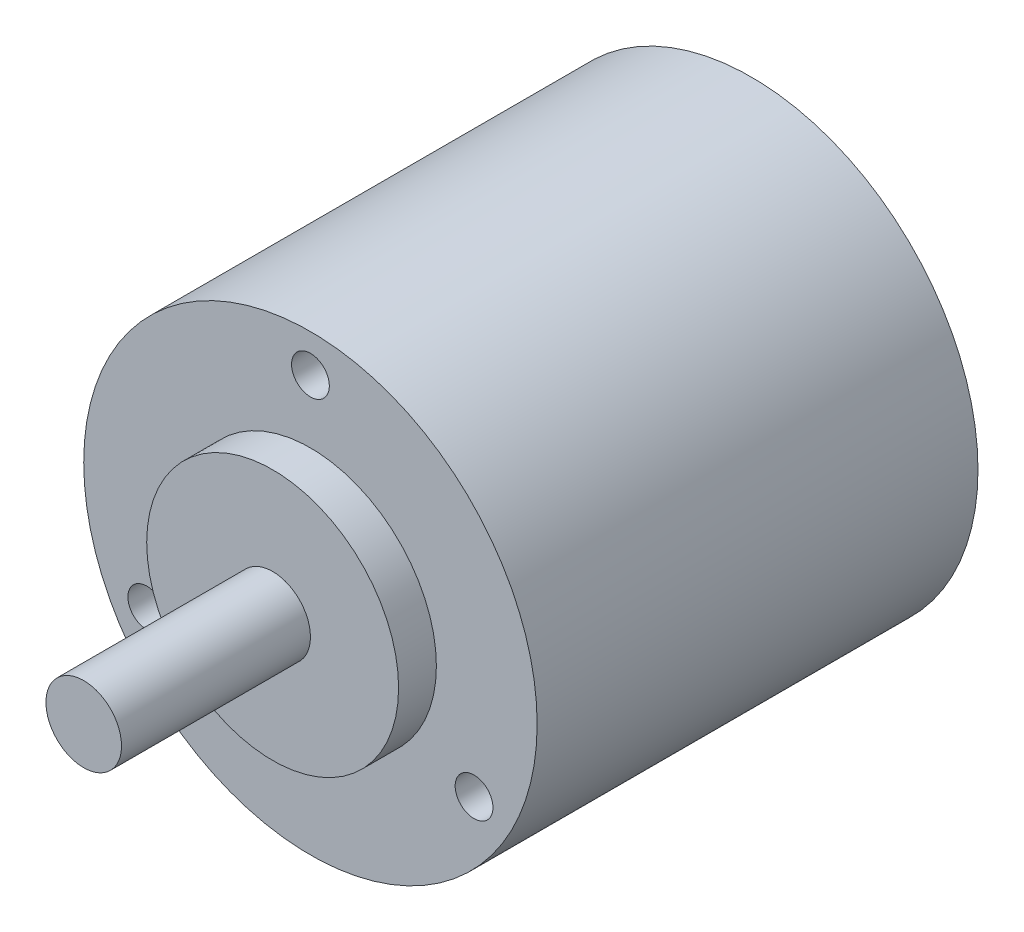
ISO-10303-21;
HEADER;
FILE_DESCRIPTION(('STEP AP214'),'2;1');
FILE_NAME('part.step','',(''),(''),'','','');
FILE_SCHEMA(('AUTOMOTIVE_DESIGN { 1 0 10303 214 1 1 1 1 }'));
ENDSEC;
DATA;
#1=APPLICATION_CONTEXT('core data for automotive mechanical design processes');
#2=APPLICATION_PROTOCOL_DEFINITION('international standard','automotive_design',2000,#1);
#3=PRODUCT_CONTEXT('',#1,'mechanical');
#4=PRODUCT('Part','Part','',(#3));
#5=PRODUCT_RELATED_PRODUCT_CATEGORY('part','',(#4));
#6=PRODUCT_DEFINITION_FORMATION('','',#4);
#7=PRODUCT_DEFINITION_CONTEXT('part definition',#1,'design');
#8=PRODUCT_DEFINITION('design','',#6,#7);
#9=PRODUCT_DEFINITION_SHAPE('','',#8);
#10=(LENGTH_UNIT() NAMED_UNIT(*) SI_UNIT(.MILLI.,.METRE.));
#11=(NAMED_UNIT(*) PLANE_ANGLE_UNIT() SI_UNIT($,.RADIAN.));
#12=(NAMED_UNIT(*) SI_UNIT($,.STERADIAN.) SOLID_ANGLE_UNIT());
#13=UNCERTAINTY_MEASURE_WITH_UNIT(LENGTH_MEASURE(1.E-05),#10,'distance_accuracy_value','');
#14=(GEOMETRIC_REPRESENTATION_CONTEXT(3) GLOBAL_UNCERTAINTY_ASSIGNED_CONTEXT((#13)) GLOBAL_UNIT_ASSIGNED_CONTEXT((#10,
#11,#12)) REPRESENTATION_CONTEXT('',''));
#15=CARTESIAN_POINT('',(0.,0.,0.));
#16=DIRECTION('',(0.,0.,1.));
#17=DIRECTION('',(1.,0.,0.));
#18=AXIS2_PLACEMENT_3D('',#15,#16,#17);
#19=CARTESIAN_POINT('',(0.,0.,35.));
#20=DIRECTION('',(0.,0.,-1.));
#21=DIRECTION('',(-1.,0.,0.));
#22=AXIS2_PLACEMENT_3D('',#19,#20,#21);
#23=CYLINDRICAL_SURFACE('',#22,18.);
#24=CARTESIAN_POINT('',(0.,0.,35.));
#25=DIRECTION('',(0.,0.,1.));
#26=DIRECTION('',(1.,0.,0.));
#27=AXIS2_PLACEMENT_3D('',#24,#25,#26);
#28=CIRCLE('',#27,18.);
#29=CARTESIAN_POINT('',(18.,0.,35.));
#30=VERTEX_POINT('',#29);
#31=EDGE_CURVE('E10',#30,#30,#28,.T.);
#32=ORIENTED_EDGE('',*,*,#31,.F.);
#33=EDGE_LOOP('',(#32));
#34=FACE_BOUND('',#33,.T.);
#35=CARTESIAN_POINT('',(0.,0.,0.));
#36=DIRECTION('',(0.,0.,1.));
#37=DIRECTION('',(1.,0.,0.));
#38=AXIS2_PLACEMENT_3D('',#35,#36,#37);
#39=CIRCLE('',#38,18.);
#40=CARTESIAN_POINT('',(18.,0.,0.));
#41=VERTEX_POINT('',#40);
#42=EDGE_CURVE('E33',#41,#41,#39,.T.);
#43=ORIENTED_EDGE('',*,*,#42,.T.);
#44=EDGE_LOOP('',(#43));
#45=FACE_BOUND('',#44,.T.);
#46=ADVANCED_FACE('F30',(#34,#45),#23,.T.);
#47=CARTESIAN_POINT('',(0.,0.,35.));
#48=DIRECTION('',(0.,0.,1.));
#49=DIRECTION('',(1.,0.,0.));
#50=AXIS2_PLACEMENT_3D('',#47,#48,#49);
#51=PLANE('',#50);
#52=CARTESIAN_POINT('',(12.9903810567675,-7.49999999999944,35.));
#53=DIRECTION('',(0.,0.,1.));
#54=DIRECTION('',(1.,0.,0.));
#55=AXIS2_PLACEMENT_3D('',#52,#53,#54);
#56=CIRCLE('',#55,1.50000000000082);
#57=CARTESIAN_POINT('',(14.4903810567684,-7.49999999999944,35.));
#58=VERTEX_POINT('',#57);
#59=EDGE_CURVE('E66',#58,#58,#56,.T.);
#60=ORIENTED_EDGE('',*,*,#59,.F.);
#61=EDGE_LOOP('',(#60));
#62=FACE_BOUND('',#61,.T.);
#63=CARTESIAN_POINT('',(-12.9903810567656,-7.50000000000056,35.));
#64=DIRECTION('',(0.,0.,1.));
#65=DIRECTION('',(1.,0.,0.));
#66=AXIS2_PLACEMENT_3D('',#63,#64,#65);
#67=CIRCLE('',#66,1.50000000000122);
#68=CARTESIAN_POINT('',(-11.4903810567644,-7.50000000000056,35.));
#69=VERTEX_POINT('',#68);
#70=EDGE_CURVE('E60',#69,#69,#67,.T.);
#71=ORIENTED_EDGE('',*,*,#70,.F.);
#72=EDGE_LOOP('',(#71));
#73=FACE_BOUND('',#72,.T.);
#74=CARTESIAN_POINT('',(0.,15.,35.));
#75=DIRECTION('',(0.,0.,1.));
#76=DIRECTION('',(1.,0.,0.));
#77=AXIS2_PLACEMENT_3D('',#74,#75,#76);
#78=CIRCLE('',#77,1.5);
#79=CARTESIAN_POINT('',(1.5,15.,35.));
#80=VERTEX_POINT('',#79);
#81=EDGE_CURVE('E54',#80,#80,#78,.T.);
#82=ORIENTED_EDGE('',*,*,#81,.F.);
#83=EDGE_LOOP('',(#82));
#84=FACE_BOUND('',#83,.T.);
#85=CARTESIAN_POINT('',(0.,0.,35.));
#86=DIRECTION('',(0.,0.,1.));
#87=DIRECTION('',(1.,0.,0.));
#88=AXIS2_PLACEMENT_3D('',#85,#86,#87);
#89=CIRCLE('',#88,10.);
#90=CARTESIAN_POINT('',(10.,0.,35.));
#91=VERTEX_POINT('',#90);
#92=EDGE_CURVE('E42',#91,#91,#89,.T.);
#93=ORIENTED_EDGE('',*,*,#92,.F.);
#94=EDGE_LOOP('',(#93));
#95=FACE_BOUND('',#94,.T.);
#96=ORIENTED_EDGE('',*,*,#31,.T.);
#97=EDGE_LOOP('',(#96));
#98=FACE_BOUND('',#97,.T.);
#99=ADVANCED_FACE('F81',(#62,#73,#84,#95,#98),#51,.T.);
#100=CARTESIAN_POINT('',(0.,0.,0.));
#101=DIRECTION('',(0.,0.,1.));
#102=DIRECTION('',(1.,0.,0.));
#103=AXIS2_PLACEMENT_3D('',#100,#101,#102);
#104=PLANE('',#103);
#105=ORIENTED_EDGE('',*,*,#42,.F.);
#106=EDGE_LOOP('',(#105));
#107=FACE_BOUND('',#106,.T.);
#108=ADVANCED_FACE('F84',(#107),#104,.F.);
#109=CARTESIAN_POINT('',(0.,0.,38.));
#110=DIRECTION('',(0.,0.,-1.));
#111=DIRECTION('',(-1.,0.,0.));
#112=AXIS2_PLACEMENT_3D('',#109,#110,#111);
#113=CYLINDRICAL_SURFACE('',#112,10.);
#114=CARTESIAN_POINT('',(0.,0.,38.));
#115=DIRECTION('',(0.,0.,1.));
#116=DIRECTION('',(1.,0.,0.));
#117=AXIS2_PLACEMENT_3D('',#114,#115,#116);
#118=CIRCLE('',#117,10.);
#119=CARTESIAN_POINT('',(10.,0.,38.));
#120=VERTEX_POINT('',#119);
#121=EDGE_CURVE('E40',#120,#120,#118,.T.);
#122=ORIENTED_EDGE('',*,*,#121,.F.);
#123=EDGE_LOOP('',(#122));
#124=FACE_BOUND('',#123,.T.);
#125=ORIENTED_EDGE('',*,*,#92,.T.);
#126=EDGE_LOOP('',(#125));
#127=FACE_BOUND('',#126,.T.);
#128=ADVANCED_FACE('F92',(#124,#127),#113,.T.);
#129=CARTESIAN_POINT('',(0.,0.,38.));
#130=DIRECTION('',(0.,0.,1.));
#131=DIRECTION('',(1.,0.,0.));
#132=AXIS2_PLACEMENT_3D('',#129,#130,#131);
#133=PLANE('',#132);
#134=CARTESIAN_POINT('',(0.,0.,38.));
#135=DIRECTION('',(0.,0.,1.));
#136=DIRECTION('',(1.,0.,0.));
#137=AXIS2_PLACEMENT_3D('',#134,#135,#136);
#138=CIRCLE('',#137,3.);
#139=CARTESIAN_POINT('',(3.,0.,38.));
#140=VERTEX_POINT('',#139);
#141=EDGE_CURVE('E48',#140,#140,#138,.T.);
#142=ORIENTED_EDGE('',*,*,#141,.F.);
#143=EDGE_LOOP('',(#142));
#144=FACE_BOUND('',#143,.T.);
#145=ORIENTED_EDGE('',*,*,#121,.T.);
#146=EDGE_LOOP('',(#145));
#147=FACE_BOUND('',#146,.T.);
#148=ADVANCED_FACE('F94',(#144,#147),#133,.T.);
#149=CARTESIAN_POINT('',(0.,0.,53.));
#150=DIRECTION('',(0.,0.,-1.));
#151=DIRECTION('',(-1.,0.,0.));
#152=AXIS2_PLACEMENT_3D('',#149,#150,#151);
#153=CYLINDRICAL_SURFACE('',#152,3.);
#154=CARTESIAN_POINT('',(0.,0.,53.));
#155=DIRECTION('',(0.,0.,1.));
#156=DIRECTION('',(1.,0.,0.));
#157=AXIS2_PLACEMENT_3D('',#154,#155,#156);
#158=CIRCLE('',#157,3.);
#159=CARTESIAN_POINT('',(3.,0.,53.));
#160=VERTEX_POINT('',#159);
#161=EDGE_CURVE('E45',#160,#160,#158,.T.);
#162=ORIENTED_EDGE('',*,*,#161,.F.);
#163=EDGE_LOOP('',(#162));
#164=FACE_BOUND('',#163,.T.);
#165=ORIENTED_EDGE('',*,*,#141,.T.);
#166=EDGE_LOOP('',(#165));
#167=FACE_BOUND('',#166,.T.);
#168=ADVANCED_FACE('F101',(#164,#167),#153,.T.);
#169=CARTESIAN_POINT('',(0.,0.,53.));
#170=DIRECTION('',(0.,0.,1.));
#171=DIRECTION('',(1.,0.,0.));
#172=AXIS2_PLACEMENT_3D('',#169,#170,#171);
#173=PLANE('',#172);
#174=ORIENTED_EDGE('',*,*,#161,.T.);
#175=EDGE_LOOP('',(#174));
#176=FACE_BOUND('',#175,.T.);
#177=ADVANCED_FACE('F140',(#176),#173,.T.);
#178=CARTESIAN_POINT('',(0.,15.,20.));
#179=DIRECTION('',(0.,0.,1.));
#180=DIRECTION('',(1.,0.,0.));
#181=AXIS2_PLACEMENT_3D('',#178,#179,#180);
#182=CYLINDRICAL_SURFACE('',#181,1.5);
#183=CARTESIAN_POINT('',(0.,15.,20.));
#184=DIRECTION('',(0.,0.,1.));
#185=DIRECTION('',(1.,0.,0.));
#186=AXIS2_PLACEMENT_3D('',#183,#184,#185);
#187=CIRCLE('',#186,1.5);
#188=CARTESIAN_POINT('',(1.5,15.,20.));
#189=VERTEX_POINT('',#188);
#190=EDGE_CURVE('E51',#189,#189,#187,.T.);
#191=ORIENTED_EDGE('',*,*,#190,.F.);
#192=EDGE_LOOP('',(#191));
#193=FACE_BOUND('',#192,.T.);
#194=ORIENTED_EDGE('',*,*,#81,.T.);
#195=EDGE_LOOP('',(#194));
#196=FACE_BOUND('',#195,.T.);
#197=ADVANCED_FACE('F149',(#193,#196),#182,.F.);
#198=CARTESIAN_POINT('',(0.,15.,20.));
#199=DIRECTION('',(0.,0.,1.));
#200=DIRECTION('',(1.,0.,0.));
#201=AXIS2_PLACEMENT_3D('',#198,#199,#200);
#202=PLANE('',#201);
#203=ORIENTED_EDGE('',*,*,#190,.T.);
#204=EDGE_LOOP('',(#203));
#205=FACE_BOUND('',#204,.T.);
#206=ADVANCED_FACE('F159',(#205),#202,.T.);
#207=CARTESIAN_POINT('',(-12.9903810567656,-7.50000000000056,20.));
#208=DIRECTION('',(0.,0.,1.));
#209=DIRECTION('',(1.,0.,0.));
#210=AXIS2_PLACEMENT_3D('',#207,#208,#209);
#211=CYLINDRICAL_SURFACE('',#210,1.50000000000122);
#212=CARTESIAN_POINT('',(-12.9903810567656,-7.50000000000056,20.));
#213=DIRECTION('',(0.,0.,1.));
#214=DIRECTION('',(1.,0.,0.));
#215=AXIS2_PLACEMENT_3D('',#212,#213,#214);
#216=CIRCLE('',#215,1.50000000000122);
#217=CARTESIAN_POINT('',(-11.4903810567644,-7.50000000000056,20.));
#218=VERTEX_POINT('',#217);
#219=EDGE_CURVE('E63',#218,#218,#216,.T.);
#220=ORIENTED_EDGE('',*,*,#219,.F.);
#221=EDGE_LOOP('',(#220));
#222=FACE_BOUND('',#221,.T.);
#223=ORIENTED_EDGE('',*,*,#70,.T.);
#224=EDGE_LOOP('',(#223));
#225=FACE_BOUND('',#224,.T.);
#226=ADVANCED_FACE('F166',(#222,#225),#211,.F.);
#227=CARTESIAN_POINT('',(-12.9903810567656,-7.50000000000056,20.));
#228=DIRECTION('',(0.,0.,1.));
#229=DIRECTION('',(1.,0.,0.));
#230=AXIS2_PLACEMENT_3D('',#227,#228,#229);
#231=PLANE('',#230);
#232=ORIENTED_EDGE('',*,*,#219,.T.);
#233=EDGE_LOOP('',(#232));
#234=FACE_BOUND('',#233,.T.);
#235=ADVANCED_FACE('F77',(#234),#231,.T.);
#236=CARTESIAN_POINT('',(12.9903810567675,-7.49999999999944,20.));
#237=DIRECTION('',(0.,0.,1.));
#238=DIRECTION('',(1.,0.,0.));
#239=AXIS2_PLACEMENT_3D('',#236,#237,#238);
#240=CYLINDRICAL_SURFACE('',#239,1.50000000000082);
#241=CARTESIAN_POINT('',(12.9903810567675,-7.49999999999944,20.));
#242=DIRECTION('',(0.,0.,1.));
#243=DIRECTION('',(1.,0.,0.));
#244=AXIS2_PLACEMENT_3D('',#241,#242,#243);
#245=CIRCLE('',#244,1.50000000000082);
#246=CARTESIAN_POINT('',(14.4903810567684,-7.49999999999944,20.));
#247=VERTEX_POINT('',#246);
#248=EDGE_CURVE('E57',#247,#247,#245,.T.);
#249=ORIENTED_EDGE('',*,*,#248,.F.);
#250=EDGE_LOOP('',(#249));
#251=FACE_BOUND('',#250,.T.);
#252=ORIENTED_EDGE('',*,*,#59,.T.);
#253=EDGE_LOOP('',(#252));
#254=FACE_BOUND('',#253,.T.);
#255=ADVANCED_FACE('F74',(#251,#254),#240,.F.);
#256=CARTESIAN_POINT('',(12.9903810567675,-7.49999999999944,20.));
#257=DIRECTION('',(0.,0.,1.));
#258=DIRECTION('',(1.,0.,0.));
#259=AXIS2_PLACEMENT_3D('',#256,#257,#258);
#260=PLANE('',#259);
#261=ORIENTED_EDGE('',*,*,#248,.T.);
#262=EDGE_LOOP('',(#261));
#263=FACE_BOUND('',#262,.T.);
#264=ADVANCED_FACE('F72',(#263),#260,.T.);
#265=CLOSED_SHELL('',(#46,#99,#108,#128,#148,#168,#177,#197,#206,#226,#235,#255,#264));
#266=MANIFOLD_SOLID_BREP('B2',#265);
#267=ADVANCED_BREP_SHAPE_REPRESENTATION('',(#18,#266),#14);
#268=SHAPE_DEFINITION_REPRESENTATION(#9,#267);
ENDSEC;
END-ISO-10303-21;
